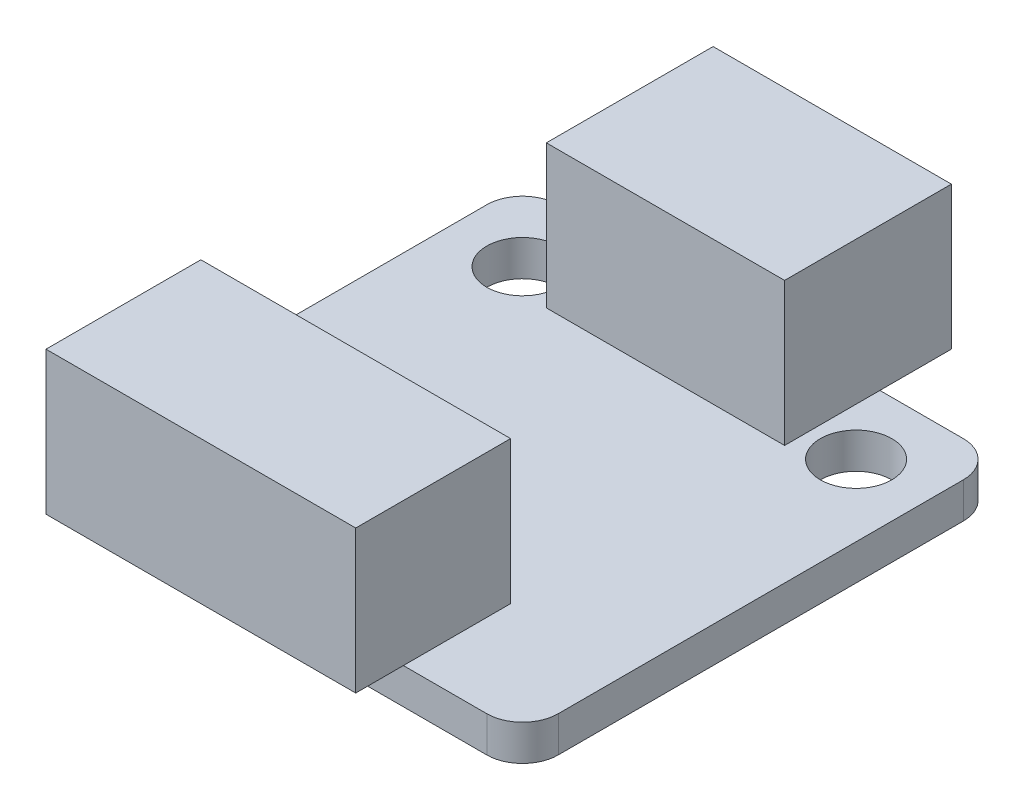
ISO-10303-21;
HEADER;
FILE_DESCRIPTION(('STEP AP214'),'2;1');
FILE_NAME('part.step','',(''),(''),'','','');
FILE_SCHEMA(('AUTOMOTIVE_DESIGN { 1 0 10303 214 1 1 1 1 }'));
ENDSEC;
DATA;
#1=APPLICATION_CONTEXT('core data for automotive mechanical design processes');
#2=APPLICATION_PROTOCOL_DEFINITION('international standard','automotive_design',2000,#1);
#3=PRODUCT_CONTEXT('',#1,'mechanical');
#4=PRODUCT('Part','Part','',(#3));
#5=PRODUCT_RELATED_PRODUCT_CATEGORY('part','',(#4));
#6=PRODUCT_DEFINITION_FORMATION('','',#4);
#7=PRODUCT_DEFINITION_CONTEXT('part definition',#1,'design');
#8=PRODUCT_DEFINITION('design','',#6,#7);
#9=PRODUCT_DEFINITION_SHAPE('','',#8);
#10=(LENGTH_UNIT() NAMED_UNIT(*) SI_UNIT(.MILLI.,.METRE.));
#11=(NAMED_UNIT(*) PLANE_ANGLE_UNIT() SI_UNIT($,.RADIAN.));
#12=(NAMED_UNIT(*) SI_UNIT($,.STERADIAN.) SOLID_ANGLE_UNIT());
#13=UNCERTAINTY_MEASURE_WITH_UNIT(LENGTH_MEASURE(1.E-05),#10,'distance_accuracy_value','');
#14=(GEOMETRIC_REPRESENTATION_CONTEXT(3) GLOBAL_UNCERTAINTY_ASSIGNED_CONTEXT((#13)) GLOBAL_UNIT_ASSIGNED_CONTEXT((#10,
#11,#12)) REPRESENTATION_CONTEXT('',''));
#15=CARTESIAN_POINT('',(0.,0.,0.));
#16=DIRECTION('',(0.,0.,1.));
#17=DIRECTION('',(1.,0.,0.));
#18=AXIS2_PLACEMENT_3D('',#15,#16,#17);
#19=CARTESIAN_POINT('',(0.,1.5,0.));
#20=DIRECTION('',(0.,1.,0.));
#21=DIRECTION('',(0.,0.,1.));
#22=AXIS2_PLACEMENT_3D('',#19,#20,#21);
#23=PLANE('',#22);
#24=CARTESIAN_POINT('',(-7.,1.5,-7.));
#25=DIRECTION('',(0.,1.,0.));
#26=DIRECTION('',(0.,0.,1.));
#27=AXIS2_PLACEMENT_3D('',#24,#25,#26);
#28=CIRCLE('',#27,1.5);
#29=CARTESIAN_POINT('',(-7.,1.5,-5.5));
#30=VERTEX_POINT('',#29);
#31=EDGE_CURVE('E217',#30,#30,#28,.T.);
#32=ORIENTED_EDGE('',*,*,#31,.F.);
#33=EDGE_LOOP('',(#32));
#34=FACE_BOUND('',#33,.T.);
#35=CARTESIAN_POINT('',(7.,1.5,-7.));
#36=DIRECTION('',(0.,1.,0.));
#37=DIRECTION('',(0.,0.,1.));
#38=AXIS2_PLACEMENT_3D('',#35,#36,#37);
#39=CIRCLE('',#38,1.5);
#40=CARTESIAN_POINT('',(7.,1.5,-5.5));
#41=VERTEX_POINT('',#40);
#42=EDGE_CURVE('E216',#41,#41,#39,.T.);
#43=ORIENTED_EDGE('',*,*,#42,.F.);
#44=EDGE_LOOP('',(#43));
#45=FACE_BOUND('',#44,.T.);
#46=DIRECTION('',(-1.,0.,0.));
#47=VECTOR('',#46,1.);
#48=CARTESIAN_POINT('',(-8.,1.5,5.5));
#49=LINE('',#48,#47);
#50=CARTESIAN_POINT('',(5.,1.5,5.5));
#51=VERTEX_POINT('',#50);
#52=CARTESIAN_POINT('',(-8.,1.5,5.5));
#53=VERTEX_POINT('',#52);
#54=EDGE_CURVE('E341',#51,#53,#49,.T.);
#55=ORIENTED_EDGE('',*,*,#54,.F.);
#56=DIRECTION('',(0.,0.,1.));
#57=VECTOR('',#56,1.);
#58=CARTESIAN_POINT('',(5.,1.5,0.));
#59=LINE('',#58,#57);
#60=CARTESIAN_POINT('',(5.,1.5,10.));
#61=VERTEX_POINT('',#60);
#62=EDGE_CURVE('E11',#51,#61,#59,.T.);
#63=ORIENTED_EDGE('',*,*,#62,.T.);
#64=DIRECTION('',(1.,0.,0.));
#65=VECTOR('',#64,1.);
#66=CARTESIAN_POINT('',(10.,1.5,10.));
#67=LINE('',#66,#65);
#68=CARTESIAN_POINT('',(8.5,1.5,10.));
#69=VERTEX_POINT('',#68);
#70=EDGE_CURVE('E232',#61,#69,#67,.T.);
#71=ORIENTED_EDGE('',*,*,#70,.T.);
#72=CARTESIAN_POINT('',(8.5,1.5,8.5));
#73=DIRECTION('',(0.,1.,0.));
#74=DIRECTION('',(0.,0.,1.));
#75=AXIS2_PLACEMENT_3D('',#72,#73,#74);
#76=CIRCLE('',#75,1.5);
#77=CARTESIAN_POINT('',(10.,1.5,8.5));
#78=VERTEX_POINT('',#77);
#79=EDGE_CURVE('E281',#69,#78,#76,.T.);
#80=ORIENTED_EDGE('',*,*,#79,.T.);
#81=DIRECTION('',(0.,0.,-1.));
#82=VECTOR('',#81,1.);
#83=CARTESIAN_POINT('',(10.,1.5,10.));
#84=LINE('',#83,#82);
#85=CARTESIAN_POINT('',(10.,1.5,-8.5));
#86=VERTEX_POINT('',#85);
#87=EDGE_CURVE('E237',#78,#86,#84,.T.);
#88=ORIENTED_EDGE('',*,*,#87,.T.);
#89=CARTESIAN_POINT('',(8.5,1.5,-8.5));
#90=DIRECTION('',(0.,1.,0.));
#91=DIRECTION('',(0.,0.,1.));
#92=AXIS2_PLACEMENT_3D('',#89,#90,#91);
#93=CIRCLE('',#92,1.5);
#94=CARTESIAN_POINT('',(8.5,1.5,-10.));
#95=VERTEX_POINT('',#94);
#96=EDGE_CURVE('E279',#86,#95,#93,.T.);
#97=ORIENTED_EDGE('',*,*,#96,.T.);
#98=DIRECTION('',(-1.,0.,0.));
#99=VECTOR('',#98,1.);
#100=CARTESIAN_POINT('',(10.,1.5,-10.));
#101=LINE('',#100,#99);
#102=CARTESIAN_POINT('',(5.,1.5,-10.));
#103=VERTEX_POINT('',#102);
#104=EDGE_CURVE('E242',#95,#103,#101,.T.);
#105=ORIENTED_EDGE('',*,*,#104,.T.);
#106=DIRECTION('',(0.,0.,-1.));
#107=VECTOR('',#106,1.);
#108=CARTESIAN_POINT('',(5.,1.5,-6.));
#109=LINE('',#108,#107);
#110=CARTESIAN_POINT('',(5.,1.5,-6.));
#111=VERTEX_POINT('',#110);
#112=EDGE_CURVE('E201',#111,#103,#109,.T.);
#113=ORIENTED_EDGE('',*,*,#112,.F.);
#114=DIRECTION('',(1.,0.,0.));
#115=VECTOR('',#114,1.);
#116=CARTESIAN_POINT('',(5.,1.5,-6.));
#117=LINE('',#116,#115);
#118=CARTESIAN_POINT('',(-5.,1.5,-6.));
#119=VERTEX_POINT('',#118);
#120=EDGE_CURVE('E56',#119,#111,#117,.T.);
#121=ORIENTED_EDGE('',*,*,#120,.F.);
#122=DIRECTION('',(0.,0.,1.));
#123=VECTOR('',#122,1.);
#124=CARTESIAN_POINT('',(-5.,1.5,-6.));
#125=LINE('',#124,#123);
#126=CARTESIAN_POINT('',(-5.,1.5,-10.));
#127=VERTEX_POINT('',#126);
#128=EDGE_CURVE('E41',#127,#119,#125,.T.);
#129=ORIENTED_EDGE('',*,*,#128,.F.);
#130=CARTESIAN_POINT('',(-8.5,1.5,-10.));
#131=VERTEX_POINT('',#130);
#132=EDGE_CURVE('E241',#127,#131,#101,.T.);
#133=ORIENTED_EDGE('',*,*,#132,.T.);
#134=CARTESIAN_POINT('',(-8.5,1.5,-8.5));
#135=DIRECTION('',(0.,1.,0.));
#136=DIRECTION('',(0.,0.,1.));
#137=AXIS2_PLACEMENT_3D('',#134,#135,#136);
#138=CIRCLE('',#137,1.5);
#139=CARTESIAN_POINT('',(-10.,1.5,-8.5));
#140=VERTEX_POINT('',#139);
#141=EDGE_CURVE('E275',#131,#140,#138,.T.);
#142=ORIENTED_EDGE('',*,*,#141,.T.);
#143=DIRECTION('',(0.,0.,1.));
#144=VECTOR('',#143,1.);
#145=CARTESIAN_POINT('',(-10.,1.5,10.));
#146=LINE('',#145,#144);
#147=CARTESIAN_POINT('',(-10.,1.5,8.5));
#148=VERTEX_POINT('',#147);
#149=EDGE_CURVE('E229',#140,#148,#146,.T.);
#150=ORIENTED_EDGE('',*,*,#149,.T.);
#151=CARTESIAN_POINT('',(-8.5,1.5,8.5));
#152=DIRECTION('',(0.,1.,0.));
#153=DIRECTION('',(0.,0.,1.));
#154=AXIS2_PLACEMENT_3D('',#151,#152,#153);
#155=CIRCLE('',#154,1.5);
#156=CARTESIAN_POINT('',(-8.5,1.5,10.));
#157=VERTEX_POINT('',#156);
#158=EDGE_CURVE('E277',#148,#157,#155,.T.);
#159=ORIENTED_EDGE('',*,*,#158,.T.);
#160=CARTESIAN_POINT('',(-8.,1.5,10.));
#161=VERTEX_POINT('',#160);
#162=EDGE_CURVE('E234',#157,#161,#67,.T.);
#163=ORIENTED_EDGE('',*,*,#162,.T.);
#164=DIRECTION('',(0.,0.,1.));
#165=VECTOR('',#164,1.);
#166=CARTESIAN_POINT('',(-8.,1.5,12.));
#167=LINE('',#166,#165);
#168=EDGE_CURVE('E340',#53,#161,#167,.T.);
#169=ORIENTED_EDGE('',*,*,#168,.F.);
#170=EDGE_LOOP('',(#55,#63,#71,#80,#88,#97,#105,#113,#121,#129,#133,#142,#150,#159,#163,#169));
#171=FACE_BOUND('',#170,.T.);
#172=ADVANCED_FACE('F33',(#34,#45,#171),#23,.T.);
#173=CARTESIAN_POINT('',(-10.,1.5,10.));
#174=DIRECTION('',(1.,0.,0.));
#175=DIRECTION('',(0.,0.,-1.));
#176=AXIS2_PLACEMENT_3D('',#173,#174,#175);
#177=PLANE('',#176);
#178=DIRECTION('',(0.,0.,1.));
#179=VECTOR('',#178,1.);
#180=CARTESIAN_POINT('',(-10.,0.,10.));
#181=LINE('',#180,#179);
#182=CARTESIAN_POINT('',(-10.,0.,-8.5));
#183=VERTEX_POINT('',#182);
#184=CARTESIAN_POINT('',(-10.,0.,8.5));
#185=VERTEX_POINT('',#184);
#186=EDGE_CURVE('E224',#183,#185,#181,.T.);
#187=ORIENTED_EDGE('',*,*,#186,.T.);
#188=DIRECTION('',(0.,-1.,0.));
#189=VECTOR('',#188,1.);
#190=CARTESIAN_POINT('',(-10.,1.5,8.5));
#191=LINE('',#190,#189);
#192=EDGE_CURVE('E291',#185,#148,#191,.F.);
#193=ORIENTED_EDGE('',*,*,#192,.T.);
#194=ORIENTED_EDGE('',*,*,#149,.F.);
#195=DIRECTION('',(0.,-1.,0.));
#196=VECTOR('',#195,1.);
#197=CARTESIAN_POINT('',(-10.,1.5,-8.5));
#198=LINE('',#197,#196);
#199=EDGE_CURVE('E289',#140,#183,#198,.T.);
#200=ORIENTED_EDGE('',*,*,#199,.T.);
#201=EDGE_LOOP('',(#187,#193,#194,#200));
#202=FACE_BOUND('',#201,.T.);
#203=ADVANCED_FACE('F324',(#202),#177,.F.);
#204=CARTESIAN_POINT('',(10.,1.5,10.));
#205=DIRECTION('',(0.,0.,-1.));
#206=DIRECTION('',(-1.,0.,0.));
#207=AXIS2_PLACEMENT_3D('',#204,#205,#206);
#208=PLANE('',#207);
#209=DIRECTION('',(1.,0.,0.));
#210=VECTOR('',#209,1.);
#211=CARTESIAN_POINT('',(10.,0.,10.));
#212=LINE('',#211,#210);
#213=CARTESIAN_POINT('',(-8.5,0.,10.));
#214=VERTEX_POINT('',#213);
#215=CARTESIAN_POINT('',(8.5,0.,10.));
#216=VERTEX_POINT('',#215);
#217=EDGE_CURVE('E249',#214,#216,#212,.T.);
#218=ORIENTED_EDGE('',*,*,#217,.T.);
#219=DIRECTION('',(0.,-1.,0.));
#220=VECTOR('',#219,1.);
#221=CARTESIAN_POINT('',(8.5,1.5,10.));
#222=LINE('',#221,#220);
#223=EDGE_CURVE('E272',#216,#69,#222,.F.);
#224=ORIENTED_EDGE('',*,*,#223,.T.);
#225=ORIENTED_EDGE('',*,*,#70,.F.);
#226=EDGE_CURVE('E238',#161,#61,#67,.T.);
#227=ORIENTED_EDGE('',*,*,#226,.F.);
#228=ORIENTED_EDGE('',*,*,#162,.F.);
#229=DIRECTION('',(0.,-1.,0.));
#230=VECTOR('',#229,1.);
#231=CARTESIAN_POINT('',(-8.5,1.5,10.));
#232=LINE('',#231,#230);
#233=EDGE_CURVE('E269',#157,#214,#232,.T.);
#234=ORIENTED_EDGE('',*,*,#233,.T.);
#235=EDGE_LOOP('',(#218,#224,#225,#227,#228,#234));
#236=FACE_BOUND('',#235,.T.);
#237=ADVANCED_FACE('F335',(#236),#208,.F.);
#238=CARTESIAN_POINT('',(10.,1.5,10.));
#239=DIRECTION('',(-1.,0.,0.));
#240=DIRECTION('',(0.,0.,1.));
#241=AXIS2_PLACEMENT_3D('',#238,#239,#240);
#242=PLANE('',#241);
#243=ORIENTED_EDGE('',*,*,#87,.F.);
#244=DIRECTION('',(0.,-1.,0.));
#245=VECTOR('',#244,1.);
#246=CARTESIAN_POINT('',(10.,1.5,8.5));
#247=LINE('',#246,#245);
#248=CARTESIAN_POINT('',(10.,0.,8.5));
#249=VERTEX_POINT('',#248);
#250=EDGE_CURVE('E258',#78,#249,#247,.T.);
#251=ORIENTED_EDGE('',*,*,#250,.T.);
#252=DIRECTION('',(0.,0.,-1.));
#253=VECTOR('',#252,1.);
#254=CARTESIAN_POINT('',(10.,0.,10.));
#255=LINE('',#254,#253);
#256=CARTESIAN_POINT('',(10.,0.,-8.5));
#257=VERTEX_POINT('',#256);
#258=EDGE_CURVE('E252',#249,#257,#255,.T.);
#259=ORIENTED_EDGE('',*,*,#258,.T.);
#260=DIRECTION('',(0.,-1.,0.));
#261=VECTOR('',#260,1.);
#262=CARTESIAN_POINT('',(10.,1.5,-8.5));
#263=LINE('',#262,#261);
#264=EDGE_CURVE('E245',#257,#86,#263,.F.);
#265=ORIENTED_EDGE('',*,*,#264,.T.);
#266=EDGE_LOOP('',(#243,#251,#259,#265));
#267=FACE_BOUND('',#266,.T.);
#268=ADVANCED_FACE('F388',(#267),#242,.F.);
#269=CARTESIAN_POINT('',(10.,1.5,-10.));
#270=DIRECTION('',(0.,0.,1.));
#271=DIRECTION('',(1.,0.,0.));
#272=AXIS2_PLACEMENT_3D('',#269,#270,#271);
#273=PLANE('',#272);
#274=ORIENTED_EDGE('',*,*,#104,.F.);
#275=DIRECTION('',(0.,-1.,0.));
#276=VECTOR('',#275,1.);
#277=CARTESIAN_POINT('',(8.5,1.5,-10.));
#278=LINE('',#277,#276);
#279=CARTESIAN_POINT('',(8.5,0.,-10.));
#280=VERTEX_POINT('',#279);
#281=EDGE_CURVE('E286',#95,#280,#278,.T.);
#282=ORIENTED_EDGE('',*,*,#281,.T.);
#283=DIRECTION('',(-1.,0.,0.));
#284=VECTOR('',#283,1.);
#285=CARTESIAN_POINT('',(10.,0.,-10.));
#286=LINE('',#285,#284);
#287=CARTESIAN_POINT('',(-8.5,0.,-10.));
#288=VERTEX_POINT('',#287);
#289=EDGE_CURVE('E233',#280,#288,#286,.T.);
#290=ORIENTED_EDGE('',*,*,#289,.T.);
#291=DIRECTION('',(0.,-1.,0.));
#292=VECTOR('',#291,1.);
#293=CARTESIAN_POINT('',(-8.5,1.5,-10.));
#294=LINE('',#293,#292);
#295=EDGE_CURVE('E283',#288,#131,#294,.F.);
#296=ORIENTED_EDGE('',*,*,#295,.T.);
#297=ORIENTED_EDGE('',*,*,#132,.F.);
#298=EDGE_CURVE('E246',#103,#127,#101,.T.);
#299=ORIENTED_EDGE('',*,*,#298,.F.);
#300=EDGE_LOOP('',(#274,#282,#290,#296,#297,#299));
#301=FACE_BOUND('',#300,.T.);
#302=ADVANCED_FACE('F319',(#301),#273,.F.);
#303=CARTESIAN_POINT('',(0.,0.,0.));
#304=DIRECTION('',(0.,1.,0.));
#305=DIRECTION('',(0.,0.,1.));
#306=AXIS2_PLACEMENT_3D('',#303,#304,#305);
#307=PLANE('',#306);
#308=CARTESIAN_POINT('',(-7.,0.,-7.));
#309=DIRECTION('',(0.,1.,0.));
#310=DIRECTION('',(0.,0.,1.));
#311=AXIS2_PLACEMENT_3D('',#308,#309,#310);
#312=CIRCLE('',#311,1.5);
#313=CARTESIAN_POINT('',(-7.,0.,-5.5));
#314=VERTEX_POINT('',#313);
#315=EDGE_CURVE('E220',#314,#314,#312,.F.);
#316=ORIENTED_EDGE('',*,*,#315,.F.);
#317=EDGE_LOOP('',(#316));
#318=FACE_BOUND('',#317,.T.);
#319=CARTESIAN_POINT('',(7.,0.,-7.));
#320=DIRECTION('',(0.,1.,0.));
#321=DIRECTION('',(0.,0.,1.));
#322=AXIS2_PLACEMENT_3D('',#319,#320,#321);
#323=CIRCLE('',#322,1.5);
#324=CARTESIAN_POINT('',(7.,0.,-5.5));
#325=VERTEX_POINT('',#324);
#326=EDGE_CURVE('E221',#325,#325,#323,.F.);
#327=ORIENTED_EDGE('',*,*,#326,.F.);
#328=EDGE_LOOP('',(#327));
#329=FACE_BOUND('',#328,.T.);
#330=ORIENTED_EDGE('',*,*,#258,.F.);
#331=CARTESIAN_POINT('',(8.5,0.,8.5));
#332=DIRECTION('',(0.,1.,0.));
#333=DIRECTION('',(0.,0.,1.));
#334=AXIS2_PLACEMENT_3D('',#331,#332,#333);
#335=CIRCLE('',#334,1.5);
#336=EDGE_CURVE('E267',#249,#216,#335,.F.);
#337=ORIENTED_EDGE('',*,*,#336,.T.);
#338=ORIENTED_EDGE('',*,*,#217,.F.);
#339=CARTESIAN_POINT('',(-8.5,0.,8.5));
#340=DIRECTION('',(0.,1.,0.));
#341=DIRECTION('',(0.,0.,1.));
#342=AXIS2_PLACEMENT_3D('',#339,#340,#341);
#343=CIRCLE('',#342,1.5);
#344=EDGE_CURVE('E263',#214,#185,#343,.F.);
#345=ORIENTED_EDGE('',*,*,#344,.T.);
#346=ORIENTED_EDGE('',*,*,#186,.F.);
#347=CARTESIAN_POINT('',(-8.5,0.,-8.5));
#348=DIRECTION('',(0.,1.,0.));
#349=DIRECTION('',(0.,0.,1.));
#350=AXIS2_PLACEMENT_3D('',#347,#348,#349);
#351=CIRCLE('',#350,1.5);
#352=EDGE_CURVE('E261',#183,#288,#351,.F.);
#353=ORIENTED_EDGE('',*,*,#352,.T.);
#354=ORIENTED_EDGE('',*,*,#289,.F.);
#355=CARTESIAN_POINT('',(8.5,0.,-8.5));
#356=DIRECTION('',(0.,1.,0.));
#357=DIRECTION('',(0.,0.,1.));
#358=AXIS2_PLACEMENT_3D('',#355,#356,#357);
#359=CIRCLE('',#358,1.5);
#360=EDGE_CURVE('E265',#280,#257,#359,.F.);
#361=ORIENTED_EDGE('',*,*,#360,.T.);
#362=EDGE_LOOP('',(#330,#337,#338,#345,#346,#353,#354,#361));
#363=FACE_BOUND('',#362,.T.);
#364=ADVANCED_FACE('F327',(#318,#329,#363),#307,.F.);
#365=CARTESIAN_POINT('',(8.5,1.5,8.5));
#366=DIRECTION('',(0.,-1.,0.));
#367=DIRECTION('',(0.,0.,-1.));
#368=AXIS2_PLACEMENT_3D('',#365,#366,#367);
#369=CYLINDRICAL_SURFACE('',#368,1.5);
#370=ORIENTED_EDGE('',*,*,#79,.F.);
#371=ORIENTED_EDGE('',*,*,#223,.F.);
#372=ORIENTED_EDGE('',*,*,#336,.F.);
#373=ORIENTED_EDGE('',*,*,#250,.F.);
#374=EDGE_LOOP('',(#370,#371,#372,#373));
#375=FACE_BOUND('',#374,.T.);
#376=ADVANCED_FACE('F384',(#375),#369,.T.);
#377=CARTESIAN_POINT('',(8.5,1.5,-8.5));
#378=DIRECTION('',(0.,-1.,0.));
#379=DIRECTION('',(0.,0.,-1.));
#380=AXIS2_PLACEMENT_3D('',#377,#378,#379);
#381=CYLINDRICAL_SURFACE('',#380,1.5);
#382=ORIENTED_EDGE('',*,*,#96,.F.);
#383=ORIENTED_EDGE('',*,*,#264,.F.);
#384=ORIENTED_EDGE('',*,*,#360,.F.);
#385=ORIENTED_EDGE('',*,*,#281,.F.);
#386=EDGE_LOOP('',(#382,#383,#384,#385));
#387=FACE_BOUND('',#386,.T.);
#388=ADVANCED_FACE('F396',(#387),#381,.T.);
#389=CARTESIAN_POINT('',(-8.5,1.5,8.5));
#390=DIRECTION('',(0.,-1.,0.));
#391=DIRECTION('',(0.,0.,-1.));
#392=AXIS2_PLACEMENT_3D('',#389,#390,#391);
#393=CYLINDRICAL_SURFACE('',#392,1.5);
#394=ORIENTED_EDGE('',*,*,#158,.F.);
#395=ORIENTED_EDGE('',*,*,#192,.F.);
#396=ORIENTED_EDGE('',*,*,#344,.F.);
#397=ORIENTED_EDGE('',*,*,#233,.F.);
#398=EDGE_LOOP('',(#394,#395,#396,#397));
#399=FACE_BOUND('',#398,.T.);
#400=ADVANCED_FACE('F332',(#399),#393,.T.);
#401=CARTESIAN_POINT('',(-8.5,1.5,-8.5));
#402=DIRECTION('',(0.,-1.,0.));
#403=DIRECTION('',(0.,0.,-1.));
#404=AXIS2_PLACEMENT_3D('',#401,#402,#403);
#405=CYLINDRICAL_SURFACE('',#404,1.5);
#406=ORIENTED_EDGE('',*,*,#141,.F.);
#407=ORIENTED_EDGE('',*,*,#295,.F.);
#408=ORIENTED_EDGE('',*,*,#352,.F.);
#409=ORIENTED_EDGE('',*,*,#199,.F.);
#410=EDGE_LOOP('',(#406,#407,#408,#409));
#411=FACE_BOUND('',#410,.T.);
#412=ADVANCED_FACE('F35',(#411),#405,.T.);
#413=CARTESIAN_POINT('',(7.,-4.24264068711929,-7.));
#414=DIRECTION('',(0.,1.,0.));
#415=DIRECTION('',(0.,0.,1.));
#416=AXIS2_PLACEMENT_3D('',#413,#414,#415);
#417=CYLINDRICAL_SURFACE('',#416,1.5);
#418=ORIENTED_EDGE('',*,*,#326,.T.);
#419=EDGE_LOOP('',(#418));
#420=FACE_BOUND('',#419,.T.);
#421=ORIENTED_EDGE('',*,*,#42,.T.);
#422=EDGE_LOOP('',(#421));
#423=FACE_BOUND('',#422,.T.);
#424=ADVANCED_FACE('F380',(#420,#423),#417,.F.);
#425=CARTESIAN_POINT('',(-7.,-4.24264068711929,-7.));
#426=DIRECTION('',(0.,1.,0.));
#427=DIRECTION('',(0.,0.,1.));
#428=AXIS2_PLACEMENT_3D('',#425,#426,#427);
#429=CYLINDRICAL_SURFACE('',#428,1.5);
#430=ORIENTED_EDGE('',*,*,#315,.T.);
#431=EDGE_LOOP('',(#430));
#432=FACE_BOUND('',#431,.T.);
#433=ORIENTED_EDGE('',*,*,#31,.T.);
#434=EDGE_LOOP('',(#433));
#435=FACE_BOUND('',#434,.T.);
#436=ADVANCED_FACE('F407',(#432,#435),#429,.F.);
#437=CARTESIAN_POINT('',(0.,1.5,0.));
#438=DIRECTION('',(0.,1.,0.));
#439=DIRECTION('',(0.,0.,1.));
#440=AXIS2_PLACEMENT_3D('',#437,#438,#439);
#441=PLANE('',#440);
#442=CARTESIAN_POINT('',(5.,1.5,-13.));
#443=VERTEX_POINT('',#442);
#444=EDGE_CURVE('E200',#103,#443,#109,.T.);
#445=ORIENTED_EDGE('',*,*,#444,.F.);
#446=ORIENTED_EDGE('',*,*,#298,.T.);
#447=CARTESIAN_POINT('',(-5.,1.5,-13.));
#448=VERTEX_POINT('',#447);
#449=EDGE_CURVE('E180',#448,#127,#125,.T.);
#450=ORIENTED_EDGE('',*,*,#449,.F.);
#451=DIRECTION('',(-1.,0.,0.));
#452=VECTOR('',#451,1.);
#453=CARTESIAN_POINT('',(5.,1.5,-13.));
#454=LINE('',#453,#452);
#455=EDGE_CURVE('E192',#443,#448,#454,.T.);
#456=ORIENTED_EDGE('',*,*,#455,.F.);
#457=EDGE_LOOP('',(#445,#446,#450,#456));
#458=FACE_BOUND('',#457,.T.);
#459=ADVANCED_FACE('F314',(#458),#441,.F.);
#460=CARTESIAN_POINT('',(-5.,7.5,-6.));
#461=DIRECTION('',(1.,0.,0.));
#462=DIRECTION('',(0.,0.,-1.));
#463=AXIS2_PLACEMENT_3D('',#460,#461,#462);
#464=PLANE('',#463);
#465=ORIENTED_EDGE('',*,*,#449,.T.);
#466=ORIENTED_EDGE('',*,*,#128,.T.);
#467=DIRECTION('',(0.,-1.,0.));
#468=VECTOR('',#467,1.);
#469=CARTESIAN_POINT('',(-5.,7.5,-6.));
#470=LINE('',#469,#468);
#471=CARTESIAN_POINT('',(-5.,7.5,-6.));
#472=VERTEX_POINT('',#471);
#473=EDGE_CURVE('E213',#472,#119,#470,.T.);
#474=ORIENTED_EDGE('',*,*,#473,.F.);
#475=DIRECTION('',(0.,0.,1.));
#476=VECTOR('',#475,1.);
#477=CARTESIAN_POINT('',(-5.,7.5,-6.));
#478=LINE('',#477,#476);
#479=CARTESIAN_POINT('',(-5.,7.5,-13.));
#480=VERTEX_POINT('',#479);
#481=EDGE_CURVE('E188',#480,#472,#478,.T.);
#482=ORIENTED_EDGE('',*,*,#481,.F.);
#483=DIRECTION('',(0.,-1.,0.));
#484=VECTOR('',#483,1.);
#485=CARTESIAN_POINT('',(-5.,7.5,-13.));
#486=LINE('',#485,#484);
#487=EDGE_CURVE('E197',#480,#448,#486,.T.);
#488=ORIENTED_EDGE('',*,*,#487,.T.);
#489=EDGE_LOOP('',(#465,#466,#474,#482,#488));
#490=FACE_BOUND('',#489,.T.);
#491=ADVANCED_FACE('F297',(#490),#464,.F.);
#492=CARTESIAN_POINT('',(5.,7.5,-6.));
#493=DIRECTION('',(0.,0.,-1.));
#494=DIRECTION('',(-1.,0.,0.));
#495=AXIS2_PLACEMENT_3D('',#492,#493,#494);
#496=PLANE('',#495);
#497=ORIENTED_EDGE('',*,*,#120,.T.);
#498=DIRECTION('',(0.,-1.,0.));
#499=VECTOR('',#498,1.);
#500=CARTESIAN_POINT('',(5.,7.5,-6.));
#501=LINE('',#500,#499);
#502=CARTESIAN_POINT('',(5.,7.5,-6.));
#503=VERTEX_POINT('',#502);
#504=EDGE_CURVE('E210',#503,#111,#501,.T.);
#505=ORIENTED_EDGE('',*,*,#504,.F.);
#506=DIRECTION('',(1.,0.,0.));
#507=VECTOR('',#506,1.);
#508=CARTESIAN_POINT('',(5.,7.5,-6.));
#509=LINE('',#508,#507);
#510=EDGE_CURVE('E191',#472,#503,#509,.T.);
#511=ORIENTED_EDGE('',*,*,#510,.F.);
#512=ORIENTED_EDGE('',*,*,#473,.T.);
#513=EDGE_LOOP('',(#497,#505,#511,#512));
#514=FACE_BOUND('',#513,.T.);
#515=ADVANCED_FACE('F302',(#514),#496,.F.);
#516=CARTESIAN_POINT('',(5.,7.5,-6.));
#517=DIRECTION('',(-1.,0.,0.));
#518=DIRECTION('',(0.,0.,1.));
#519=AXIS2_PLACEMENT_3D('',#516,#517,#518);
#520=PLANE('',#519);
#521=ORIENTED_EDGE('',*,*,#112,.T.);
#522=ORIENTED_EDGE('',*,*,#444,.T.);
#523=DIRECTION('',(0.,-1.,0.));
#524=VECTOR('',#523,1.);
#525=CARTESIAN_POINT('',(5.,7.5,-13.));
#526=LINE('',#525,#524);
#527=CARTESIAN_POINT('',(5.,7.5,-13.));
#528=VERTEX_POINT('',#527);
#529=EDGE_CURVE('E207',#528,#443,#526,.T.);
#530=ORIENTED_EDGE('',*,*,#529,.F.);
#531=DIRECTION('',(0.,0.,-1.));
#532=VECTOR('',#531,1.);
#533=CARTESIAN_POINT('',(5.,7.5,-6.));
#534=LINE('',#533,#532);
#535=EDGE_CURVE('E194',#503,#528,#534,.T.);
#536=ORIENTED_EDGE('',*,*,#535,.F.);
#537=ORIENTED_EDGE('',*,*,#504,.T.);
#538=EDGE_LOOP('',(#521,#522,#530,#536,#537));
#539=FACE_BOUND('',#538,.T.);
#540=ADVANCED_FACE('F427',(#539),#520,.F.);
#541=CARTESIAN_POINT('',(5.,7.5,-13.));
#542=DIRECTION('',(0.,0.,1.));
#543=DIRECTION('',(1.,0.,0.));
#544=AXIS2_PLACEMENT_3D('',#541,#542,#543);
#545=PLANE('',#544);
#546=ORIENTED_EDGE('',*,*,#455,.T.);
#547=ORIENTED_EDGE('',*,*,#487,.F.);
#548=DIRECTION('',(-1.,0.,0.));
#549=VECTOR('',#548,1.);
#550=CARTESIAN_POINT('',(5.,7.5,-13.));
#551=LINE('',#550,#549);
#552=EDGE_CURVE('E196',#528,#480,#551,.T.);
#553=ORIENTED_EDGE('',*,*,#552,.F.);
#554=ORIENTED_EDGE('',*,*,#529,.T.);
#555=EDGE_LOOP('',(#546,#547,#553,#554));
#556=FACE_BOUND('',#555,.T.);
#557=ADVANCED_FACE('F430',(#556),#545,.F.);
#558=CARTESIAN_POINT('',(0.,7.5,0.));
#559=DIRECTION('',(0.,1.,0.));
#560=DIRECTION('',(0.,0.,1.));
#561=AXIS2_PLACEMENT_3D('',#558,#559,#560);
#562=PLANE('',#561);
#563=ORIENTED_EDGE('',*,*,#481,.T.);
#564=ORIENTED_EDGE('',*,*,#510,.T.);
#565=ORIENTED_EDGE('',*,*,#535,.T.);
#566=ORIENTED_EDGE('',*,*,#552,.T.);
#567=EDGE_LOOP('',(#563,#564,#565,#566));
#568=FACE_BOUND('',#567,.T.);
#569=ADVANCED_FACE('F306',(#568),#562,.T.);
#570=CARTESIAN_POINT('',(0.,1.5,0.));
#571=DIRECTION('',(0.,-1.,0.));
#572=DIRECTION('',(0.,0.,-1.));
#573=AXIS2_PLACEMENT_3D('',#570,#571,#572);
#574=PLANE('',#573);
#575=ORIENTED_EDGE('',*,*,#226,.T.);
#576=DIRECTION('',(0.,0.,-1.));
#577=VECTOR('',#576,1.);
#578=CARTESIAN_POINT('',(5.,1.5,12.));
#579=LINE('',#578,#577);
#580=CARTESIAN_POINT('',(5.,1.5,12.));
#581=VERTEX_POINT('',#580);
#582=EDGE_CURVE('E357',#581,#61,#579,.T.);
#583=ORIENTED_EDGE('',*,*,#582,.F.);
#584=DIRECTION('',(1.,0.,0.));
#585=VECTOR('',#584,1.);
#586=CARTESIAN_POINT('',(-8.,1.5,12.));
#587=LINE('',#586,#585);
#588=CARTESIAN_POINT('',(-8.,1.5,12.));
#589=VERTEX_POINT('',#588);
#590=EDGE_CURVE('E176',#589,#581,#587,.T.);
#591=ORIENTED_EDGE('',*,*,#590,.F.);
#592=EDGE_CURVE('E342',#161,#589,#167,.T.);
#593=ORIENTED_EDGE('',*,*,#592,.F.);
#594=EDGE_LOOP('',(#575,#583,#591,#593));
#595=FACE_BOUND('',#594,.T.);
#596=ADVANCED_FACE('F356',(#595),#574,.T.);
#597=CARTESIAN_POINT('',(5.,7.5,12.));
#598=DIRECTION('',(-1.,0.,0.));
#599=DIRECTION('',(0.,0.,1.));
#600=AXIS2_PLACEMENT_3D('',#597,#598,#599);
#601=PLANE('',#600);
#602=ORIENTED_EDGE('',*,*,#582,.T.);
#603=ORIENTED_EDGE('',*,*,#62,.F.);
#604=DIRECTION('',(0.,-1.,0.));
#605=VECTOR('',#604,1.);
#606=CARTESIAN_POINT('',(5.,7.5,5.5));
#607=LINE('',#606,#605);
#608=CARTESIAN_POINT('',(5.,7.5,5.5));
#609=VERTEX_POINT('',#608);
#610=EDGE_CURVE('E163',#609,#51,#607,.T.);
#611=ORIENTED_EDGE('',*,*,#610,.F.);
#612=DIRECTION('',(0.,0.,-1.));
#613=VECTOR('',#612,1.);
#614=CARTESIAN_POINT('',(5.,7.5,12.));
#615=LINE('',#614,#613);
#616=CARTESIAN_POINT('',(5.,7.5,12.));
#617=VERTEX_POINT('',#616);
#618=EDGE_CURVE('E167',#617,#609,#615,.T.);
#619=ORIENTED_EDGE('',*,*,#618,.F.);
#620=DIRECTION('',(0.,-1.,0.));
#621=VECTOR('',#620,1.);
#622=CARTESIAN_POINT('',(5.,7.5,12.));
#623=LINE('',#622,#621);
#624=EDGE_CURVE('E348',#617,#581,#623,.T.);
#625=ORIENTED_EDGE('',*,*,#624,.T.);
#626=EDGE_LOOP('',(#602,#603,#611,#619,#625));
#627=FACE_BOUND('',#626,.T.);
#628=ADVANCED_FACE('F179',(#627),#601,.F.);
#629=CARTESIAN_POINT('',(-8.,7.5,5.5));
#630=DIRECTION('',(0.,0.,1.));
#631=DIRECTION('',(1.,0.,0.));
#632=AXIS2_PLACEMENT_3D('',#629,#630,#631);
#633=PLANE('',#632);
#634=ORIENTED_EDGE('',*,*,#54,.T.);
#635=DIRECTION('',(0.,-1.,0.));
#636=VECTOR('',#635,1.);
#637=CARTESIAN_POINT('',(-8.,7.5,5.5));
#638=LINE('',#637,#636);
#639=CARTESIAN_POINT('',(-8.,7.5,5.5));
#640=VERTEX_POINT('',#639);
#641=EDGE_CURVE('E48',#640,#53,#638,.T.);
#642=ORIENTED_EDGE('',*,*,#641,.F.);
#643=DIRECTION('',(-1.,0.,0.));
#644=VECTOR('',#643,1.);
#645=CARTESIAN_POINT('',(-8.,7.5,5.5));
#646=LINE('',#645,#644);
#647=EDGE_CURVE('E159',#609,#640,#646,.T.);
#648=ORIENTED_EDGE('',*,*,#647,.F.);
#649=ORIENTED_EDGE('',*,*,#610,.T.);
#650=EDGE_LOOP('',(#634,#642,#648,#649));
#651=FACE_BOUND('',#650,.T.);
#652=ADVANCED_FACE('F161',(#651),#633,.F.);
#653=CARTESIAN_POINT('',(-8.,7.5,12.));
#654=DIRECTION('',(1.,0.,0.));
#655=DIRECTION('',(0.,0.,-1.));
#656=AXIS2_PLACEMENT_3D('',#653,#654,#655);
#657=PLANE('',#656);
#658=ORIENTED_EDGE('',*,*,#168,.T.);
#659=ORIENTED_EDGE('',*,*,#592,.T.);
#660=DIRECTION('',(0.,-1.,0.));
#661=VECTOR('',#660,1.);
#662=CARTESIAN_POINT('',(-8.,7.5,12.));
#663=LINE('',#662,#661);
#664=CARTESIAN_POINT('',(-8.,7.5,12.));
#665=VERTEX_POINT('',#664);
#666=EDGE_CURVE('E184',#665,#589,#663,.T.);
#667=ORIENTED_EDGE('',*,*,#666,.F.);
#668=DIRECTION('',(0.,0.,1.));
#669=VECTOR('',#668,1.);
#670=CARTESIAN_POINT('',(-8.,7.5,12.));
#671=LINE('',#670,#669);
#672=EDGE_CURVE('E166',#640,#665,#671,.T.);
#673=ORIENTED_EDGE('',*,*,#672,.F.);
#674=ORIENTED_EDGE('',*,*,#641,.T.);
#675=EDGE_LOOP('',(#658,#659,#667,#673,#674));
#676=FACE_BOUND('',#675,.T.);
#677=ADVANCED_FACE('F360',(#676),#657,.F.);
#678=CARTESIAN_POINT('',(-8.,7.5,12.));
#679=DIRECTION('',(0.,0.,-1.));
#680=DIRECTION('',(-1.,0.,0.));
#681=AXIS2_PLACEMENT_3D('',#678,#679,#680);
#682=PLANE('',#681);
#683=ORIENTED_EDGE('',*,*,#590,.T.);
#684=ORIENTED_EDGE('',*,*,#624,.F.);
#685=DIRECTION('',(1.,0.,0.));
#686=VECTOR('',#685,1.);
#687=CARTESIAN_POINT('',(-8.,7.5,12.));
#688=LINE('',#687,#686);
#689=EDGE_CURVE('E172',#665,#617,#688,.T.);
#690=ORIENTED_EDGE('',*,*,#689,.F.);
#691=ORIENTED_EDGE('',*,*,#666,.T.);
#692=EDGE_LOOP('',(#683,#684,#690,#691));
#693=FACE_BOUND('',#692,.T.);
#694=ADVANCED_FACE('F353',(#693),#682,.F.);
#695=CARTESIAN_POINT('',(0.,7.5,0.));
#696=DIRECTION('',(0.,-1.,0.));
#697=DIRECTION('',(0.,0.,-1.));
#698=AXIS2_PLACEMENT_3D('',#695,#696,#697);
#699=PLANE('',#698);
#700=ORIENTED_EDGE('',*,*,#618,.T.);
#701=ORIENTED_EDGE('',*,*,#647,.T.);
#702=ORIENTED_EDGE('',*,*,#672,.T.);
#703=ORIENTED_EDGE('',*,*,#689,.T.);
#704=EDGE_LOOP('',(#700,#701,#702,#703));
#705=FACE_BOUND('',#704,.T.);
#706=ADVANCED_FACE('F170',(#705),#699,.F.);
#707=CLOSED_SHELL('',(#172,#203,#237,#268,#302,#364,#376,#388,#400,#412,#424,#436,#459,#491,
#515,#540,#557,#569,#596,#628,#652,#677,#694,#706));
#708=MANIFOLD_SOLID_BREP('B2',#707);
#709=ADVANCED_BREP_SHAPE_REPRESENTATION('',(#18,#708),#14);
#710=SHAPE_DEFINITION_REPRESENTATION(#9,#709);
ENDSEC;
END-ISO-10303-21;
